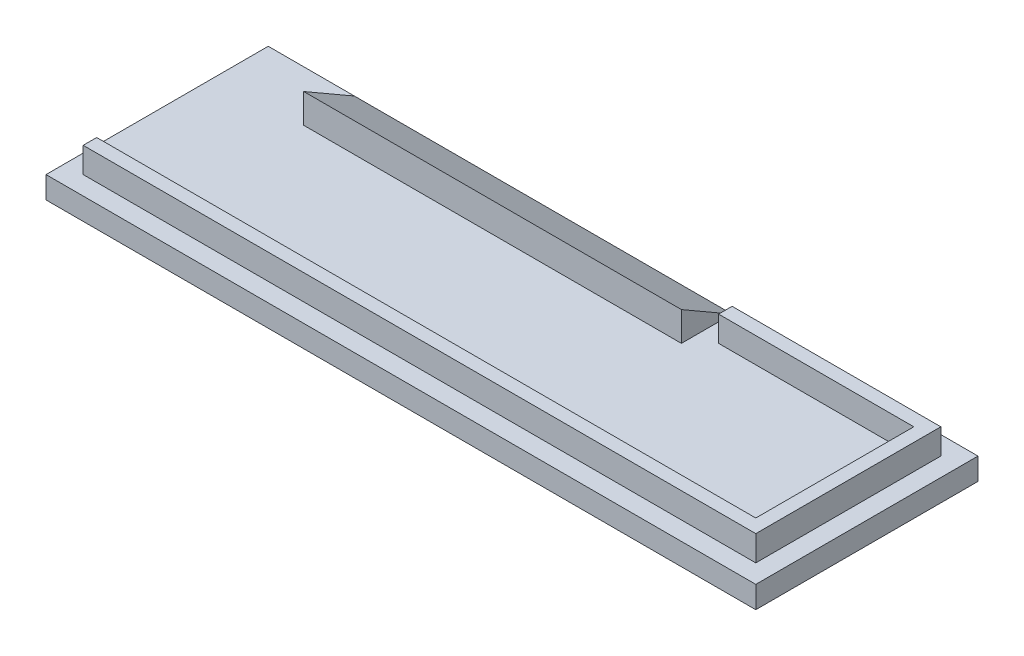
ISO-10303-21;
HEADER;
FILE_DESCRIPTION(('STEP AP214'),'2;1');
FILE_NAME('part.step','',(''),(''),'','','');
FILE_SCHEMA(('AUTOMOTIVE_DESIGN { 1 0 10303 214 1 1 1 1 }'));
ENDSEC;
DATA;
#1=APPLICATION_CONTEXT('core data for automotive mechanical design processes');
#2=APPLICATION_PROTOCOL_DEFINITION('international standard','automotive_design',2000,#1);
#3=PRODUCT_CONTEXT('',#1,'mechanical');
#4=PRODUCT('Part','Part','',(#3));
#5=PRODUCT_RELATED_PRODUCT_CATEGORY('part','',(#4));
#6=PRODUCT_DEFINITION_FORMATION('','',#4);
#7=PRODUCT_DEFINITION_CONTEXT('part definition',#1,'design');
#8=PRODUCT_DEFINITION('design','',#6,#7);
#9=PRODUCT_DEFINITION_SHAPE('','',#8);
#10=(LENGTH_UNIT() NAMED_UNIT(*) SI_UNIT(.MILLI.,.METRE.));
#11=(NAMED_UNIT(*) PLANE_ANGLE_UNIT() SI_UNIT($,.RADIAN.));
#12=(NAMED_UNIT(*) SI_UNIT($,.STERADIAN.) SOLID_ANGLE_UNIT());
#13=UNCERTAINTY_MEASURE_WITH_UNIT(LENGTH_MEASURE(1.E-05),#10,'distance_accuracy_value','');
#14=(GEOMETRIC_REPRESENTATION_CONTEXT(3) GLOBAL_UNCERTAINTY_ASSIGNED_CONTEXT((#13)) GLOBAL_UNIT_ASSIGNED_CONTEXT((#10,
#11,#12)) REPRESENTATION_CONTEXT('',''));
#15=CARTESIAN_POINT('',(0.,0.,0.));
#16=DIRECTION('',(0.,0.,1.));
#17=DIRECTION('',(1.,0.,0.));
#18=AXIS2_PLACEMENT_3D('',#15,#16,#17);
#19=CARTESIAN_POINT('',(0.,1.3,0.));
#20=DIRECTION('',(0.,-1.,0.));
#21=DIRECTION('',(0.,0.,-1.));
#22=AXIS2_PLACEMENT_3D('',#19,#20,#21);
#23=PLANE('',#22);
#24=DIRECTION('',(0.,0.,1.));
#25=VECTOR('',#24,1.);
#26=CARTESIAN_POINT('',(5.1,1.3,-13.15));
#27=LINE('',#26,#25);
#28=CARTESIAN_POINT('',(5.1,1.3,-13.15));
#29=VERTEX_POINT('',#28);
#30=CARTESIAN_POINT('',(5.1,1.3,-10.15));
#31=VERTEX_POINT('',#30);
#32=EDGE_CURVE('E170',#29,#31,#27,.T.);
#33=ORIENTED_EDGE('',*,*,#32,.F.);
#34=DIRECTION('',(-1.,0.,0.));
#35=VECTOR('',#34,1.);
#36=CARTESIAN_POINT('',(0.,1.3,-13.15));
#37=LINE('',#36,#35);
#38=CARTESIAN_POINT('',(0.,1.3,-13.15));
#39=VERTEX_POINT('',#38);
#40=EDGE_CURVE('E206',#29,#39,#37,.T.);
#41=ORIENTED_EDGE('',*,*,#40,.T.);
#42=DIRECTION('',(0.,0.,1.));
#43=VECTOR('',#42,1.);
#44=CARTESIAN_POINT('',(0.,1.3,0.));
#45=LINE('',#44,#43);
#46=CARTESIAN_POINT('',(0.,1.3,0.));
#47=VERTEX_POINT('',#46);
#48=EDGE_CURVE('E198',#39,#47,#45,.T.);
#49=ORIENTED_EDGE('',*,*,#48,.T.);
#50=DIRECTION('',(1.,0.,0.));
#51=VECTOR('',#50,1.);
#52=CARTESIAN_POINT('',(0.,1.3,0.));
#53=LINE('',#52,#51);
#54=CARTESIAN_POINT('',(42.,1.3,0.));
#55=VERTEX_POINT('',#54);
#56=EDGE_CURVE('E201',#47,#55,#53,.T.);
#57=ORIENTED_EDGE('',*,*,#56,.T.);
#58=DIRECTION('',(0.,0.,-1.));
#59=VECTOR('',#58,1.);
#60=CARTESIAN_POINT('',(42.,1.3,0.));
#61=LINE('',#60,#59);
#62=CARTESIAN_POINT('',(42.,1.3,-13.15));
#63=VERTEX_POINT('',#62);
#64=EDGE_CURVE('E204',#55,#63,#61,.T.);
#65=ORIENTED_EDGE('',*,*,#64,.T.);
#66=CARTESIAN_POINT('',(27.45,1.3,-13.15));
#67=VERTEX_POINT('',#66);
#68=EDGE_CURVE('E207',#63,#67,#37,.T.);
#69=ORIENTED_EDGE('',*,*,#68,.T.);
#70=DIRECTION('',(0.,0.,1.));
#71=VECTOR('',#70,1.);
#72=CARTESIAN_POINT('',(27.45,1.3,-13.15));
#73=LINE('',#72,#71);
#74=CARTESIAN_POINT('',(27.45,1.3,-10.15));
#75=VERTEX_POINT('',#74);
#76=EDGE_CURVE('E179',#67,#75,#73,.T.);
#77=ORIENTED_EDGE('',*,*,#76,.T.);
#78=DIRECTION('',(-1.,0.,0.));
#79=VECTOR('',#78,1.);
#80=CARTESIAN_POINT('',(27.45,1.3,-10.15));
#81=LINE('',#80,#79);
#82=EDGE_CURVE('E194',#75,#31,#81,.T.);
#83=ORIENTED_EDGE('',*,*,#82,.T.);
#84=EDGE_LOOP('',(#33,#41,#49,#57,#65,#69,#77,#83));
#85=FACE_BOUND('',#84,.T.);
#86=DIRECTION('',(0.,0.,-1.));
#87=VECTOR('',#86,1.);
#88=CARTESIAN_POINT('',(40.9,1.3,0.));
#89=LINE('',#88,#87);
#90=CARTESIAN_POINT('',(40.9,1.3,-1.1));
#91=VERTEX_POINT('',#90);
#92=CARTESIAN_POINT('',(40.9,1.3,-12.05));
#93=VERTEX_POINT('',#92);
#94=EDGE_CURVE('E166',#91,#93,#89,.T.);
#95=ORIENTED_EDGE('',*,*,#94,.F.);
#96=DIRECTION('',(1.,0.,0.));
#97=VECTOR('',#96,1.);
#98=CARTESIAN_POINT('',(0.,1.3,-1.1));
#99=LINE('',#98,#97);
#100=CARTESIAN_POINT('',(1.1,1.3,-1.1));
#101=VERTEX_POINT('',#100);
#102=EDGE_CURVE('E163',#101,#91,#99,.T.);
#103=ORIENTED_EDGE('',*,*,#102,.F.);
#104=DIRECTION('',(0.,0.,1.));
#105=VECTOR('',#104,1.);
#106=CARTESIAN_POINT('',(1.1,1.3,0.));
#107=LINE('',#106,#105);
#108=CARTESIAN_POINT('',(1.1,1.3,-1.9));
#109=VERTEX_POINT('',#108);
#110=EDGE_CURVE('E463',#109,#101,#107,.T.);
#111=ORIENTED_EDGE('',*,*,#110,.F.);
#112=DIRECTION('',(-1.,0.,0.));
#113=VECTOR('',#112,1.);
#114=CARTESIAN_POINT('',(0.,1.3,-1.9));
#115=LINE('',#114,#113);
#116=CARTESIAN_POINT('',(40.1,1.3,-1.9));
#117=VERTEX_POINT('',#116);
#118=EDGE_CURVE('E494',#117,#109,#115,.T.);
#119=ORIENTED_EDGE('',*,*,#118,.F.);
#120=DIRECTION('',(0.,0.,1.));
#121=VECTOR('',#120,1.);
#122=CARTESIAN_POINT('',(40.1,1.3,0.));
#123=LINE('',#122,#121);
#124=CARTESIAN_POINT('',(40.1,1.3,-11.25));
#125=VERTEX_POINT('',#124);
#126=EDGE_CURVE('E487',#125,#117,#123,.T.);
#127=ORIENTED_EDGE('',*,*,#126,.F.);
#128=DIRECTION('',(1.,0.,0.));
#129=VECTOR('',#128,1.);
#130=CARTESIAN_POINT('',(0.,1.3,-11.25));
#131=LINE('',#130,#129);
#132=CARTESIAN_POINT('',(28.55,1.3,-11.25));
#133=VERTEX_POINT('',#132);
#134=EDGE_CURVE('E484',#133,#125,#131,.T.);
#135=ORIENTED_EDGE('',*,*,#134,.F.);
#136=DIRECTION('',(0.,0.,1.));
#137=VECTOR('',#136,1.);
#138=CARTESIAN_POINT('',(28.55,1.3,0.));
#139=LINE('',#138,#137);
#140=CARTESIAN_POINT('',(28.55,1.3,-12.05));
#141=VERTEX_POINT('',#140);
#142=EDGE_CURVE('E59',#141,#133,#139,.T.);
#143=ORIENTED_EDGE('',*,*,#142,.F.);
#144=DIRECTION('',(-1.,0.,0.));
#145=VECTOR('',#144,1.);
#146=CARTESIAN_POINT('',(0.,1.3,-12.05));
#147=LINE('',#146,#145);
#148=EDGE_CURVE('E54',#93,#141,#147,.T.);
#149=ORIENTED_EDGE('',*,*,#148,.F.);
#150=EDGE_LOOP('',(#95,#103,#111,#119,#127,#135,#143,#149));
#151=FACE_BOUND('',#150,.T.);
#152=ADVANCED_FACE('F39',(#85,#151),#23,.F.);
#153=CARTESIAN_POINT('',(0.,1.3,0.));
#154=DIRECTION('',(1.,0.,0.));
#155=DIRECTION('',(0.,0.,-1.));
#156=AXIS2_PLACEMENT_3D('',#153,#154,#155);
#157=PLANE('',#156);
#158=DIRECTION('',(0.,0.,1.));
#159=VECTOR('',#158,1.);
#160=CARTESIAN_POINT('',(0.,0.,0.));
#161=LINE('',#160,#159);
#162=CARTESIAN_POINT('',(0.,0.,-13.15));
#163=VERTEX_POINT('',#162);
#164=CARTESIAN_POINT('',(0.,0.,0.));
#165=VERTEX_POINT('',#164);
#166=EDGE_CURVE('E193',#163,#165,#161,.T.);
#167=ORIENTED_EDGE('',*,*,#166,.T.);
#168=DIRECTION('',(0.,-1.,0.));
#169=VECTOR('',#168,1.);
#170=CARTESIAN_POINT('',(0.,1.3,0.));
#171=LINE('',#170,#169);
#172=EDGE_CURVE('E11',#47,#165,#171,.T.);
#173=ORIENTED_EDGE('',*,*,#172,.F.);
#174=ORIENTED_EDGE('',*,*,#48,.F.);
#175=DIRECTION('',(0.,-1.,0.));
#176=VECTOR('',#175,1.);
#177=CARTESIAN_POINT('',(0.,1.3,-13.15));
#178=LINE('',#177,#176);
#179=EDGE_CURVE('E210',#39,#163,#178,.T.);
#180=ORIENTED_EDGE('',*,*,#179,.T.);
#181=EDGE_LOOP('',(#167,#173,#174,#180));
#182=FACE_BOUND('',#181,.T.);
#183=ADVANCED_FACE('F41',(#182),#157,.F.);
#184=CARTESIAN_POINT('',(0.,1.3,0.));
#185=DIRECTION('',(0.,0.,-1.));
#186=DIRECTION('',(-1.,0.,0.));
#187=AXIS2_PLACEMENT_3D('',#184,#185,#186);
#188=PLANE('',#187);
#189=DIRECTION('',(1.,0.,0.));
#190=VECTOR('',#189,1.);
#191=CARTESIAN_POINT('',(0.,0.,0.));
#192=LINE('',#191,#190);
#193=CARTESIAN_POINT('',(42.,0.,0.));
#194=VERTEX_POINT('',#193);
#195=EDGE_CURVE('E213',#165,#194,#192,.T.);
#196=ORIENTED_EDGE('',*,*,#195,.T.);
#197=DIRECTION('',(0.,-1.,0.));
#198=VECTOR('',#197,1.);
#199=CARTESIAN_POINT('',(42.,1.3,0.));
#200=LINE('',#199,#198);
#201=EDGE_CURVE('E47',#55,#194,#200,.T.);
#202=ORIENTED_EDGE('',*,*,#201,.F.);
#203=ORIENTED_EDGE('',*,*,#56,.F.);
#204=ORIENTED_EDGE('',*,*,#172,.T.);
#205=EDGE_LOOP('',(#196,#202,#203,#204));
#206=FACE_BOUND('',#205,.T.);
#207=ADVANCED_FACE('F270',(#206),#188,.F.);
#208=CARTESIAN_POINT('',(42.,1.3,0.));
#209=DIRECTION('',(-1.,0.,0.));
#210=DIRECTION('',(0.,0.,1.));
#211=AXIS2_PLACEMENT_3D('',#208,#209,#210);
#212=PLANE('',#211);
#213=DIRECTION('',(0.,0.,-1.));
#214=VECTOR('',#213,1.);
#215=CARTESIAN_POINT('',(42.,0.,0.));
#216=LINE('',#215,#214);
#217=CARTESIAN_POINT('',(42.,0.,-13.15));
#218=VERTEX_POINT('',#217);
#219=EDGE_CURVE('E215',#194,#218,#216,.T.);
#220=ORIENTED_EDGE('',*,*,#219,.T.);
#221=DIRECTION('',(0.,-1.,0.));
#222=VECTOR('',#221,1.);
#223=CARTESIAN_POINT('',(42.,1.3,-13.15));
#224=LINE('',#223,#222);
#225=EDGE_CURVE('E220',#63,#218,#224,.T.);
#226=ORIENTED_EDGE('',*,*,#225,.F.);
#227=ORIENTED_EDGE('',*,*,#64,.F.);
#228=ORIENTED_EDGE('',*,*,#201,.T.);
#229=EDGE_LOOP('',(#220,#226,#227,#228));
#230=FACE_BOUND('',#229,.T.);
#231=ADVANCED_FACE('F227',(#230),#212,.F.);
#232=CARTESIAN_POINT('',(0.,1.3,-13.15));
#233=DIRECTION('',(0.,0.,1.));
#234=DIRECTION('',(1.,0.,0.));
#235=AXIS2_PLACEMENT_3D('',#232,#233,#234);
#236=PLANE('',#235);
#237=DIRECTION('',(-1.,0.,0.));
#238=VECTOR('',#237,1.);
#239=CARTESIAN_POINT('',(0.,0.,-13.15));
#240=LINE('',#239,#238);
#241=EDGE_CURVE('E202',#218,#163,#240,.T.);
#242=ORIENTED_EDGE('',*,*,#241,.T.);
#243=ORIENTED_EDGE('',*,*,#179,.F.);
#244=ORIENTED_EDGE('',*,*,#40,.F.);
#245=DIRECTION('',(-1.,0.,0.));
#246=VECTOR('',#245,1.);
#247=CARTESIAN_POINT('',(27.45,1.3,-13.15));
#248=LINE('',#247,#246);
#249=EDGE_CURVE('E185',#67,#29,#248,.T.);
#250=ORIENTED_EDGE('',*,*,#249,.F.);
#251=ORIENTED_EDGE('',*,*,#68,.F.);
#252=ORIENTED_EDGE('',*,*,#225,.T.);
#253=EDGE_LOOP('',(#242,#243,#244,#250,#251,#252));
#254=FACE_BOUND('',#253,.T.);
#255=ADVANCED_FACE('F236',(#254),#236,.F.);
#256=CARTESIAN_POINT('',(0.,0.,0.));
#257=DIRECTION('',(0.,-1.,0.));
#258=DIRECTION('',(0.,0.,-1.));
#259=AXIS2_PLACEMENT_3D('',#256,#257,#258);
#260=PLANE('',#259);
#261=ORIENTED_EDGE('',*,*,#166,.F.);
#262=ORIENTED_EDGE('',*,*,#241,.F.);
#263=ORIENTED_EDGE('',*,*,#219,.F.);
#264=ORIENTED_EDGE('',*,*,#195,.F.);
#265=EDGE_LOOP('',(#261,#262,#263,#264));
#266=FACE_BOUND('',#265,.T.);
#267=ADVANCED_FACE('F233',(#266),#260,.T.);
#268=CARTESIAN_POINT('',(27.45,3.03205080756885,-10.15));
#269=DIRECTION('',(0.,0.866025403784441,-0.499999999999995));
#270=DIRECTION('',(0.,0.499999999999995,0.866025403784442));
#271=AXIS2_PLACEMENT_3D('',#268,#269,#270);
#272=PLANE('',#271);
#273=DIRECTION('',(0.,-0.499999999999995,-0.866025403784441));
#274=VECTOR('',#273,1.);
#275=CARTESIAN_POINT('',(5.1,3.03205080756885,-10.15));
#276=LINE('',#275,#274);
#277=CARTESIAN_POINT('',(5.1,3.03205080756885,-10.15));
#278=VERTEX_POINT('',#277);
#279=EDGE_CURVE('E167',#278,#29,#276,.T.);
#280=ORIENTED_EDGE('',*,*,#279,.F.);
#281=DIRECTION('',(-1.,0.,0.));
#282=VECTOR('',#281,1.);
#283=CARTESIAN_POINT('',(27.45,3.03205080756885,-10.15));
#284=LINE('',#283,#282);
#285=CARTESIAN_POINT('',(27.45,3.03205080756885,-10.15));
#286=VERTEX_POINT('',#285);
#287=EDGE_CURVE('E191',#286,#278,#284,.T.);
#288=ORIENTED_EDGE('',*,*,#287,.F.);
#289=DIRECTION('',(0.,-0.499999999999995,-0.866025403784441));
#290=VECTOR('',#289,1.);
#291=CARTESIAN_POINT('',(27.45,3.03205080756885,-10.15));
#292=LINE('',#291,#290);
#293=EDGE_CURVE('E176',#286,#67,#292,.T.);
#294=ORIENTED_EDGE('',*,*,#293,.T.);
#295=ORIENTED_EDGE('',*,*,#249,.T.);
#296=EDGE_LOOP('',(#280,#288,#294,#295));
#297=FACE_BOUND('',#296,.T.);
#298=ADVANCED_FACE('F251',(#297),#272,.T.);
#299=CARTESIAN_POINT('',(27.45,1.3,-10.15));
#300=DIRECTION('',(0.,0.,1.));
#301=DIRECTION('',(1.,0.,0.));
#302=AXIS2_PLACEMENT_3D('',#299,#300,#301);
#303=PLANE('',#302);
#304=DIRECTION('',(0.,1.,0.));
#305=VECTOR('',#304,1.);
#306=CARTESIAN_POINT('',(5.1,1.3,-10.15));
#307=LINE('',#306,#305);
#308=EDGE_CURVE('E180',#31,#278,#307,.T.);
#309=ORIENTED_EDGE('',*,*,#308,.F.);
#310=ORIENTED_EDGE('',*,*,#82,.F.);
#311=DIRECTION('',(0.,1.,0.));
#312=VECTOR('',#311,1.);
#313=CARTESIAN_POINT('',(27.45,1.3,-10.15));
#314=LINE('',#313,#312);
#315=EDGE_CURVE('E183',#75,#286,#314,.T.);
#316=ORIENTED_EDGE('',*,*,#315,.T.);
#317=ORIENTED_EDGE('',*,*,#287,.T.);
#318=EDGE_LOOP('',(#309,#310,#316,#317));
#319=FACE_BOUND('',#318,.T.);
#320=ADVANCED_FACE('F253',(#319),#303,.T.);
#321=CARTESIAN_POINT('',(27.45,0.,0.));
#322=DIRECTION('',(1.,0.,0.));
#323=DIRECTION('',(0.,0.,-1.));
#324=AXIS2_PLACEMENT_3D('',#321,#322,#323);
#325=PLANE('',#324);
#326=ORIENTED_EDGE('',*,*,#293,.F.);
#327=ORIENTED_EDGE('',*,*,#315,.F.);
#328=ORIENTED_EDGE('',*,*,#76,.F.);
#329=EDGE_LOOP('',(#326,#327,#328));
#330=FACE_BOUND('',#329,.T.);
#331=ADVANCED_FACE('F250',(#330),#325,.T.);
#332=CARTESIAN_POINT('',(5.1,0.,0.));
#333=DIRECTION('',(1.,0.,0.));
#334=DIRECTION('',(0.,0.,-1.));
#335=AXIS2_PLACEMENT_3D('',#332,#333,#334);
#336=PLANE('',#335);
#337=ORIENTED_EDGE('',*,*,#279,.T.);
#338=ORIENTED_EDGE('',*,*,#32,.T.);
#339=ORIENTED_EDGE('',*,*,#308,.T.);
#340=EDGE_LOOP('',(#337,#338,#339));
#341=FACE_BOUND('',#340,.T.);
#342=ADVANCED_FACE('F255',(#341),#336,.F.);
#343=CARTESIAN_POINT('',(40.9,2.8,0.));
#344=DIRECTION('',(-1.,0.,0.));
#345=DIRECTION('',(0.,0.,1.));
#346=AXIS2_PLACEMENT_3D('',#343,#344,#345);
#347=PLANE('',#346);
#348=ORIENTED_EDGE('',*,*,#94,.T.);
#349=DIRECTION('',(0.,-1.,0.));
#350=VECTOR('',#349,1.);
#351=CARTESIAN_POINT('',(40.9,2.8,-12.05));
#352=LINE('',#351,#350);
#353=CARTESIAN_POINT('',(40.9,2.8,-12.05));
#354=VERTEX_POINT('',#353);
#355=EDGE_CURVE('E147',#354,#93,#352,.T.);
#356=ORIENTED_EDGE('',*,*,#355,.F.);
#357=DIRECTION('',(0.,0.,-1.));
#358=VECTOR('',#357,1.);
#359=CARTESIAN_POINT('',(40.9,2.8,0.));
#360=LINE('',#359,#358);
#361=CARTESIAN_POINT('',(40.9,2.8,-1.1));
#362=VERTEX_POINT('',#361);
#363=EDGE_CURVE('E154',#362,#354,#360,.T.);
#364=ORIENTED_EDGE('',*,*,#363,.F.);
#365=DIRECTION('',(0.,-1.,0.));
#366=VECTOR('',#365,1.);
#367=CARTESIAN_POINT('',(40.9,2.8,-1.1));
#368=LINE('',#367,#366);
#369=EDGE_CURVE('E459',#362,#91,#368,.T.);
#370=ORIENTED_EDGE('',*,*,#369,.T.);
#371=EDGE_LOOP('',(#348,#356,#364,#370));
#372=FACE_BOUND('',#371,.T.);
#373=ADVANCED_FACE('F165',(#372),#347,.F.);
#374=CARTESIAN_POINT('',(0.,2.8,-12.05));
#375=DIRECTION('',(0.,0.,1.));
#376=DIRECTION('',(1.,0.,0.));
#377=AXIS2_PLACEMENT_3D('',#374,#375,#376);
#378=PLANE('',#377);
#379=ORIENTED_EDGE('',*,*,#148,.T.);
#380=DIRECTION('',(0.,-1.,0.));
#381=VECTOR('',#380,1.);
#382=CARTESIAN_POINT('',(28.55,2.8,-12.05));
#383=LINE('',#382,#381);
#384=CARTESIAN_POINT('',(28.55,2.8,-12.05));
#385=VERTEX_POINT('',#384);
#386=EDGE_CURVE('E150',#385,#141,#383,.T.);
#387=ORIENTED_EDGE('',*,*,#386,.F.);
#388=DIRECTION('',(-1.,0.,0.));
#389=VECTOR('',#388,1.);
#390=CARTESIAN_POINT('',(0.,2.8,-12.05));
#391=LINE('',#390,#389);
#392=EDGE_CURVE('E143',#354,#385,#391,.T.);
#393=ORIENTED_EDGE('',*,*,#392,.F.);
#394=ORIENTED_EDGE('',*,*,#355,.T.);
#395=EDGE_LOOP('',(#379,#387,#393,#394));
#396=FACE_BOUND('',#395,.T.);
#397=ADVANCED_FACE('F145',(#396),#378,.F.);
#398=CARTESIAN_POINT('',(28.55,2.8,0.));
#399=DIRECTION('',(1.,0.,0.));
#400=DIRECTION('',(0.,0.,-1.));
#401=AXIS2_PLACEMENT_3D('',#398,#399,#400);
#402=PLANE('',#401);
#403=ORIENTED_EDGE('',*,*,#142,.T.);
#404=DIRECTION('',(0.,-1.,0.));
#405=VECTOR('',#404,1.);
#406=CARTESIAN_POINT('',(28.55,2.8,-11.25));
#407=LINE('',#406,#405);
#408=CARTESIAN_POINT('',(28.55,2.8,-11.25));
#409=VERTEX_POINT('',#408);
#410=EDGE_CURVE('E172',#409,#133,#407,.T.);
#411=ORIENTED_EDGE('',*,*,#410,.F.);
#412=DIRECTION('',(0.,0.,1.));
#413=VECTOR('',#412,1.);
#414=CARTESIAN_POINT('',(28.55,2.8,0.));
#415=LINE('',#414,#413);
#416=EDGE_CURVE('E153',#385,#409,#415,.T.);
#417=ORIENTED_EDGE('',*,*,#416,.F.);
#418=ORIENTED_EDGE('',*,*,#386,.T.);
#419=EDGE_LOOP('',(#403,#411,#417,#418));
#420=FACE_BOUND('',#419,.T.);
#421=ADVANCED_FACE('F336',(#420),#402,.F.);
#422=CARTESIAN_POINT('',(0.,2.8,-11.25));
#423=DIRECTION('',(0.,0.,-1.));
#424=DIRECTION('',(-1.,0.,0.));
#425=AXIS2_PLACEMENT_3D('',#422,#423,#424);
#426=PLANE('',#425);
#427=ORIENTED_EDGE('',*,*,#134,.T.);
#428=DIRECTION('',(0.,-1.,0.));
#429=VECTOR('',#428,1.);
#430=CARTESIAN_POINT('',(40.1,2.8,-11.25));
#431=LINE('',#430,#429);
#432=CARTESIAN_POINT('',(40.1,2.8,-11.25));
#433=VERTEX_POINT('',#432);
#434=EDGE_CURVE('E477',#433,#125,#431,.T.);
#435=ORIENTED_EDGE('',*,*,#434,.F.);
#436=DIRECTION('',(1.,0.,0.));
#437=VECTOR('',#436,1.);
#438=CARTESIAN_POINT('',(0.,2.8,-11.25));
#439=LINE('',#438,#437);
#440=EDGE_CURVE('E485',#409,#433,#439,.T.);
#441=ORIENTED_EDGE('',*,*,#440,.F.);
#442=ORIENTED_EDGE('',*,*,#410,.T.);
#443=EDGE_LOOP('',(#427,#435,#441,#442));
#444=FACE_BOUND('',#443,.T.);
#445=ADVANCED_FACE('F346',(#444),#426,.F.);
#446=CARTESIAN_POINT('',(40.1,2.8,0.));
#447=DIRECTION('',(1.,0.,0.));
#448=DIRECTION('',(0.,0.,-1.));
#449=AXIS2_PLACEMENT_3D('',#446,#447,#448);
#450=PLANE('',#449);
#451=ORIENTED_EDGE('',*,*,#126,.T.);
#452=DIRECTION('',(0.,-1.,0.));
#453=VECTOR('',#452,1.);
#454=CARTESIAN_POINT('',(40.1,2.8,-1.9));
#455=LINE('',#454,#453);
#456=CARTESIAN_POINT('',(40.1,2.8,-1.9));
#457=VERTEX_POINT('',#456);
#458=EDGE_CURVE('E474',#457,#117,#455,.T.);
#459=ORIENTED_EDGE('',*,*,#458,.F.);
#460=DIRECTION('',(0.,0.,1.));
#461=VECTOR('',#460,1.);
#462=CARTESIAN_POINT('',(40.1,2.8,0.));
#463=LINE('',#462,#461);
#464=EDGE_CURVE('E502',#433,#457,#463,.T.);
#465=ORIENTED_EDGE('',*,*,#464,.F.);
#466=ORIENTED_EDGE('',*,*,#434,.T.);
#467=EDGE_LOOP('',(#451,#459,#465,#466));
#468=FACE_BOUND('',#467,.T.);
#469=ADVANCED_FACE('F357',(#468),#450,.F.);
#470=CARTESIAN_POINT('',(0.,2.8,-1.9));
#471=DIRECTION('',(0.,0.,1.));
#472=DIRECTION('',(1.,0.,0.));
#473=AXIS2_PLACEMENT_3D('',#470,#471,#472);
#474=PLANE('',#473);
#475=ORIENTED_EDGE('',*,*,#118,.T.);
#476=DIRECTION('',(0.,-1.,0.));
#477=VECTOR('',#476,1.);
#478=CARTESIAN_POINT('',(1.1,2.8,-1.9));
#479=LINE('',#478,#477);
#480=CARTESIAN_POINT('',(1.1,2.8,-1.9));
#481=VERTEX_POINT('',#480);
#482=EDGE_CURVE('E466',#481,#109,#479,.T.);
#483=ORIENTED_EDGE('',*,*,#482,.F.);
#484=DIRECTION('',(-1.,0.,0.));
#485=VECTOR('',#484,1.);
#486=CARTESIAN_POINT('',(0.,2.8,-1.9));
#487=LINE('',#486,#485);
#488=EDGE_CURVE('E500',#457,#481,#487,.T.);
#489=ORIENTED_EDGE('',*,*,#488,.F.);
#490=ORIENTED_EDGE('',*,*,#458,.T.);
#491=EDGE_LOOP('',(#475,#483,#489,#490));
#492=FACE_BOUND('',#491,.T.);
#493=ADVANCED_FACE('F368',(#492),#474,.F.);
#494=CARTESIAN_POINT('',(1.1,2.8,0.));
#495=DIRECTION('',(1.,0.,0.));
#496=DIRECTION('',(0.,0.,-1.));
#497=AXIS2_PLACEMENT_3D('',#494,#495,#496);
#498=PLANE('',#497);
#499=ORIENTED_EDGE('',*,*,#110,.T.);
#500=DIRECTION('',(0.,-1.,0.));
#501=VECTOR('',#500,1.);
#502=CARTESIAN_POINT('',(1.1,2.8,-1.1));
#503=LINE('',#502,#501);
#504=CARTESIAN_POINT('',(1.1,2.8,-1.1));
#505=VERTEX_POINT('',#504);
#506=EDGE_CURVE('E461',#505,#101,#503,.T.);
#507=ORIENTED_EDGE('',*,*,#506,.F.);
#508=DIRECTION('',(0.,0.,1.));
#509=VECTOR('',#508,1.);
#510=CARTESIAN_POINT('',(1.1,2.8,0.));
#511=LINE('',#510,#509);
#512=EDGE_CURVE('E468',#481,#505,#511,.T.);
#513=ORIENTED_EDGE('',*,*,#512,.F.);
#514=ORIENTED_EDGE('',*,*,#482,.T.);
#515=EDGE_LOOP('',(#499,#507,#513,#514));
#516=FACE_BOUND('',#515,.T.);
#517=ADVANCED_FACE('F379',(#516),#498,.F.);
#518=CARTESIAN_POINT('',(0.,2.8,-1.1));
#519=DIRECTION('',(0.,0.,-1.));
#520=DIRECTION('',(-1.,0.,0.));
#521=AXIS2_PLACEMENT_3D('',#518,#519,#520);
#522=PLANE('',#521);
#523=ORIENTED_EDGE('',*,*,#102,.T.);
#524=ORIENTED_EDGE('',*,*,#369,.F.);
#525=DIRECTION('',(1.,0.,0.));
#526=VECTOR('',#525,1.);
#527=CARTESIAN_POINT('',(0.,2.8,-1.1));
#528=LINE('',#527,#526);
#529=EDGE_CURVE('E159',#505,#362,#528,.T.);
#530=ORIENTED_EDGE('',*,*,#529,.F.);
#531=ORIENTED_EDGE('',*,*,#506,.T.);
#532=EDGE_LOOP('',(#523,#524,#530,#531));
#533=FACE_BOUND('',#532,.T.);
#534=ADVANCED_FACE('F390',(#533),#522,.F.);
#535=CARTESIAN_POINT('',(0.,2.8,0.));
#536=DIRECTION('',(0.,1.,0.));
#537=DIRECTION('',(0.,0.,1.));
#538=AXIS2_PLACEMENT_3D('',#535,#536,#537);
#539=PLANE('',#538);
#540=ORIENTED_EDGE('',*,*,#363,.T.);
#541=ORIENTED_EDGE('',*,*,#392,.T.);
#542=ORIENTED_EDGE('',*,*,#416,.T.);
#543=ORIENTED_EDGE('',*,*,#440,.T.);
#544=ORIENTED_EDGE('',*,*,#464,.T.);
#545=ORIENTED_EDGE('',*,*,#488,.T.);
#546=ORIENTED_EDGE('',*,*,#512,.T.);
#547=ORIENTED_EDGE('',*,*,#529,.T.);
#548=EDGE_LOOP('',(#540,#541,#542,#543,#544,#545,#546,#547));
#549=FACE_BOUND('',#548,.T.);
#550=ADVANCED_FACE('F157',(#549),#539,.T.);
#551=CLOSED_SHELL('',(#152,#183,#207,#231,#255,#267,#298,#320,#331,#342,#373,#397,#421,#445,
#469,#493,#517,#534,#550));
#552=MANIFOLD_SOLID_BREP('B2',#551);
#553=ADVANCED_BREP_SHAPE_REPRESENTATION('',(#18,#552),#14);
#554=SHAPE_DEFINITION_REPRESENTATION(#9,#553);
ENDSEC;
END-ISO-10303-21;
